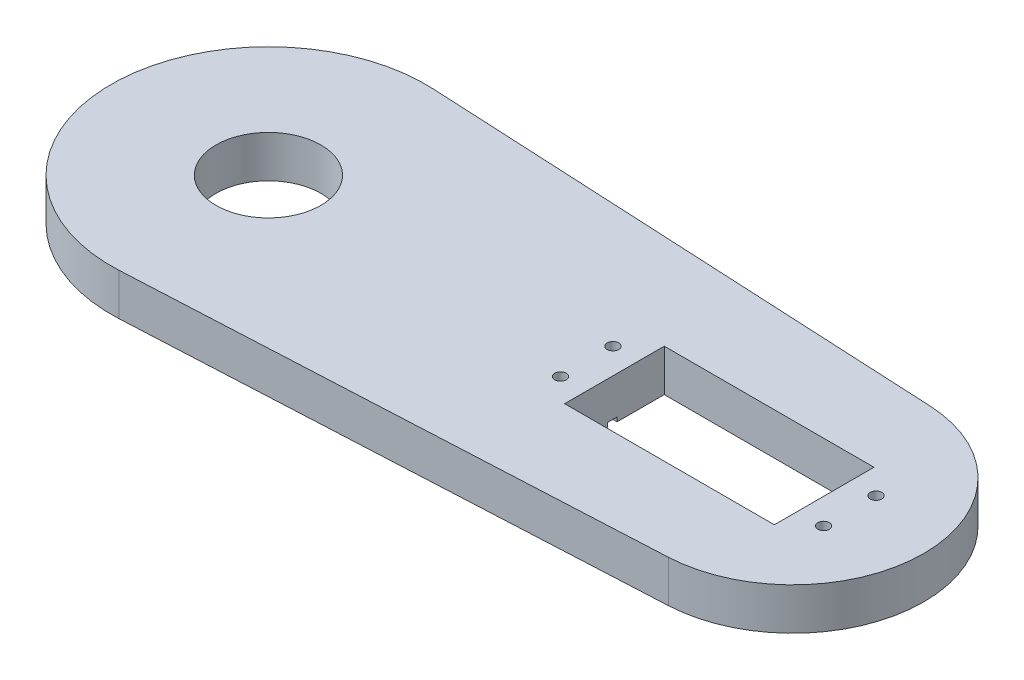
ISO-10303-21;
HEADER;
FILE_DESCRIPTION(('STEP AP214'),'2;1');
FILE_NAME('part.step','',(''),(''),'','','');
FILE_SCHEMA(('AUTOMOTIVE_DESIGN { 1 0 10303 214 1 1 1 1 }'));
ENDSEC;
DATA;
#1=APPLICATION_CONTEXT('core data for automotive mechanical design processes');
#2=APPLICATION_PROTOCOL_DEFINITION('international standard','automotive_design',2000,#1);
#3=PRODUCT_CONTEXT('',#1,'mechanical');
#4=PRODUCT('Part','Part','',(#3));
#5=PRODUCT_RELATED_PRODUCT_CATEGORY('part','',(#4));
#6=PRODUCT_DEFINITION_FORMATION('','',#4);
#7=PRODUCT_DEFINITION_CONTEXT('part definition',#1,'design');
#8=PRODUCT_DEFINITION('design','',#6,#7);
#9=PRODUCT_DEFINITION_SHAPE('','',#8);
#10=(LENGTH_UNIT() NAMED_UNIT(*) SI_UNIT(.MILLI.,.METRE.));
#11=(NAMED_UNIT(*) PLANE_ANGLE_UNIT() SI_UNIT($,.RADIAN.));
#12=(NAMED_UNIT(*) SI_UNIT($,.STERADIAN.) SOLID_ANGLE_UNIT());
#13=UNCERTAINTY_MEASURE_WITH_UNIT(LENGTH_MEASURE(1.E-05),#10,'distance_accuracy_value','');
#14=(GEOMETRIC_REPRESENTATION_CONTEXT(3) GLOBAL_UNCERTAINTY_ASSIGNED_CONTEXT((#13)) GLOBAL_UNIT_ASSIGNED_CONTEXT((#10,
#11,#12)) REPRESENTATION_CONTEXT('',''));
#15=CARTESIAN_POINT('',(0.,0.,0.));
#16=DIRECTION('',(0.,0.,1.));
#17=DIRECTION('',(1.,0.,0.));
#18=AXIS2_PLACEMENT_3D('',#15,#16,#17);
#19=CARTESIAN_POINT('',(100.,8.,0.));
#20=DIRECTION('',(0.,1.,0.));
#21=DIRECTION('',(0.,0.,1.));
#22=AXIS2_PLACEMENT_3D('',#19,#20,#21);
#23=PLANE('',#22);
#24=CARTESIAN_POINT('',(0.,8.,0.));
#25=DIRECTION('',(0.,-1.,0.));
#26=DIRECTION('',(0.,0.,-1.));
#27=AXIS2_PLACEMENT_3D('',#24,#25,#26);
#28=CIRCLE('',#27,10.);
#29=CARTESIAN_POINT('',(0.,8.,-10.));
#30=VERTEX_POINT('',#29);
#31=EDGE_CURVE('E204',#30,#30,#28,.T.);
#32=ORIENTED_EDGE('',*,*,#31,.T.);
#33=EDGE_LOOP('',(#32));
#34=FACE_BOUND('',#33,.T.);
#35=CARTESIAN_POINT('',(61.1116070970547,8.,-4.6));
#36=DIRECTION('',(0.,1.,0.));
#37=DIRECTION('',(0.,0.,1.));
#38=AXIS2_PLACEMENT_3D('',#35,#36,#37);
#39=CIRCLE('',#38,1.1);
#40=CARTESIAN_POINT('',(61.1116070970547,8.,-3.5));
#41=VERTEX_POINT('',#40);
#42=EDGE_CURVE('E215',#41,#41,#39,.T.);
#43=ORIENTED_EDGE('',*,*,#42,.F.);
#44=EDGE_LOOP('',(#43));
#45=FACE_BOUND('',#44,.T.);
#46=CARTESIAN_POINT('',(110.89,8.,5.));
#47=DIRECTION('',(0.,1.,0.));
#48=DIRECTION('',(0.,0.,1.));
#49=AXIS2_PLACEMENT_3D('',#46,#47,#48);
#50=CIRCLE('',#49,1.10000000000001);
#51=CARTESIAN_POINT('',(110.89,8.,6.10000000000001));
#52=VERTEX_POINT('',#51);
#53=EDGE_CURVE('E227',#52,#52,#50,.T.);
#54=ORIENTED_EDGE('',*,*,#53,.F.);
#55=EDGE_LOOP('',(#54));
#56=FACE_BOUND('',#55,.T.);
#57=CARTESIAN_POINT('',(100.,8.,0.));
#58=DIRECTION('',(0.,1.,0.));
#59=DIRECTION('',(0.,0.,1.));
#60=AXIS2_PLACEMENT_3D('',#57,#58,#59);
#61=CIRCLE('',#60,25.);
#62=CARTESIAN_POINT('',(101.25,8.,24.9687304442977));
#63=VERTEX_POINT('',#62);
#64=CARTESIAN_POINT('',(101.25,8.,-24.9687304442977));
#65=VERTEX_POINT('',#64);
#66=EDGE_CURVE('E273',#63,#65,#61,.T.);
#67=ORIENTED_EDGE('',*,*,#66,.T.);
#68=DIRECTION('',(-0.998749217771909,0.,-0.05));
#69=VECTOR('',#68,1.);
#70=CARTESIAN_POINT('',(1.5,8.,-29.9624765331573));
#71=LINE('',#70,#69);
#72=CARTESIAN_POINT('',(1.5,8.,-29.9624765331573));
#73=VERTEX_POINT('',#72);
#74=EDGE_CURVE('E276',#65,#73,#71,.T.);
#75=ORIENTED_EDGE('',*,*,#74,.T.);
#76=CARTESIAN_POINT('',(0.,8.,0.));
#77=DIRECTION('',(0.,1.,0.));
#78=DIRECTION('',(0.,0.,1.));
#79=AXIS2_PLACEMENT_3D('',#76,#77,#78);
#80=CIRCLE('',#79,30.);
#81=CARTESIAN_POINT('',(1.5,8.,29.9624765331573));
#82=VERTEX_POINT('',#81);
#83=EDGE_CURVE('E279',#73,#82,#80,.T.);
#84=ORIENTED_EDGE('',*,*,#83,.T.);
#85=DIRECTION('',(0.998749217771909,0.,-0.05));
#86=VECTOR('',#85,1.);
#87=CARTESIAN_POINT('',(1.5,8.,29.9624765331573));
#88=LINE('',#87,#86);
#89=EDGE_CURVE('E281',#82,#63,#88,.T.);
#90=ORIENTED_EDGE('',*,*,#89,.T.);
#91=EDGE_LOOP('',(#67,#75,#84,#90));
#92=FACE_BOUND('',#91,.T.);
#93=CARTESIAN_POINT('',(110.89,8.,-5.));
#94=DIRECTION('',(0.,1.,0.));
#95=DIRECTION('',(0.,0.,1.));
#96=AXIS2_PLACEMENT_3D('',#93,#94,#95);
#97=CIRCLE('',#96,1.10000000000001);
#98=CARTESIAN_POINT('',(110.89,8.,-3.89999999999999));
#99=VERTEX_POINT('',#98);
#100=EDGE_CURVE('E267',#99,#99,#97,.T.);
#101=ORIENTED_EDGE('',*,*,#100,.F.);
#102=EDGE_LOOP('',(#101));
#103=FACE_BOUND('',#102,.T.);
#104=DIRECTION('',(1.,0.,0.));
#105=VECTOR('',#104,1.);
#106=CARTESIAN_POINT('',(66.,8.,9.5));
#107=LINE('',#106,#105);
#108=CARTESIAN_POINT('',(66.,8.,9.5));
#109=VERTEX_POINT('',#108);
#110=CARTESIAN_POINT('',(106.,8.,9.50000000000001));
#111=VERTEX_POINT('',#110);
#112=EDGE_CURVE('E235',#109,#111,#107,.T.);
#113=ORIENTED_EDGE('',*,*,#112,.F.);
#114=DIRECTION('',(0.,0.,1.));
#115=VECTOR('',#114,1.);
#116=CARTESIAN_POINT('',(66.,8.,9.5));
#117=LINE('',#116,#115);
#118=CARTESIAN_POINT('',(66.,8.,-9.5));
#119=VERTEX_POINT('',#118);
#120=EDGE_CURVE('E233',#119,#109,#117,.T.);
#121=ORIENTED_EDGE('',*,*,#120,.F.);
#122=DIRECTION('',(-1.,0.,0.));
#123=VECTOR('',#122,1.);
#124=CARTESIAN_POINT('',(66.,8.,-9.5));
#125=LINE('',#124,#123);
#126=CARTESIAN_POINT('',(106.,8.,-9.5));
#127=VERTEX_POINT('',#126);
#128=EDGE_CURVE('E241',#127,#119,#125,.T.);
#129=ORIENTED_EDGE('',*,*,#128,.F.);
#130=DIRECTION('',(0.,0.,-1.));
#131=VECTOR('',#130,1.);
#132=CARTESIAN_POINT('',(106.,8.,9.50000000000001));
#133=LINE('',#132,#131);
#134=EDGE_CURVE('E238',#111,#127,#133,.T.);
#135=ORIENTED_EDGE('',*,*,#134,.F.);
#136=EDGE_LOOP('',(#113,#121,#129,#135));
#137=FACE_BOUND('',#136,.T.);
#138=CARTESIAN_POINT('',(61.1116070970547,8.,5.4));
#139=DIRECTION('',(0.,1.,0.));
#140=DIRECTION('',(0.,0.,1.));
#141=AXIS2_PLACEMENT_3D('',#138,#139,#140);
#142=CIRCLE('',#141,1.1);
#143=CARTESIAN_POINT('',(61.1116070970547,8.,6.5));
#144=VERTEX_POINT('',#143);
#145=EDGE_CURVE('E221',#144,#144,#142,.T.);
#146=ORIENTED_EDGE('',*,*,#145,.F.);
#147=EDGE_LOOP('',(#146));
#148=FACE_BOUND('',#147,.T.);
#149=ADVANCED_FACE('F36',(#34,#45,#56,#92,#103,#137,#148),#23,.T.);
#150=CARTESIAN_POINT('',(100.,0.,0.));
#151=DIRECTION('',(0.,1.,0.));
#152=DIRECTION('',(0.,0.,1.));
#153=AXIS2_PLACEMENT_3D('',#150,#151,#152);
#154=PLANE('',#153);
#155=CARTESIAN_POINT('',(0.,0.,0.));
#156=DIRECTION('',(0.,-1.,0.));
#157=DIRECTION('',(0.,0.,-1.));
#158=AXIS2_PLACEMENT_3D('',#155,#156,#157);
#159=CIRCLE('',#158,10.);
#160=CARTESIAN_POINT('',(0.,0.,-10.));
#161=VERTEX_POINT('',#160);
#162=EDGE_CURVE('E176',#161,#161,#159,.T.);
#163=ORIENTED_EDGE('',*,*,#162,.F.);
#164=EDGE_LOOP('',(#163));
#165=FACE_BOUND('',#164,.T.);
#166=CARTESIAN_POINT('',(110.89,0.,-5.));
#167=DIRECTION('',(0.,1.,0.));
#168=DIRECTION('',(0.,0.,1.));
#169=AXIS2_PLACEMENT_3D('',#166,#167,#168);
#170=CIRCLE('',#169,1.10000000000001);
#171=CARTESIAN_POINT('',(110.89,0.,-3.89999999999999));
#172=VERTEX_POINT('',#171);
#173=EDGE_CURVE('E266',#172,#172,#170,.T.);
#174=ORIENTED_EDGE('',*,*,#173,.T.);
#175=EDGE_LOOP('',(#174));
#176=FACE_BOUND('',#175,.T.);
#177=CARTESIAN_POINT('',(100.,0.,0.));
#178=DIRECTION('',(0.,1.,0.));
#179=DIRECTION('',(0.,0.,1.));
#180=AXIS2_PLACEMENT_3D('',#177,#178,#179);
#181=CIRCLE('',#180,25.);
#182=CARTESIAN_POINT('',(101.25,0.,24.9687304442977));
#183=VERTEX_POINT('',#182);
#184=CARTESIAN_POINT('',(101.25,0.,-24.9687304442977));
#185=VERTEX_POINT('',#184);
#186=EDGE_CURVE('E270',#183,#185,#181,.T.);
#187=ORIENTED_EDGE('',*,*,#186,.F.);
#188=DIRECTION('',(0.998749217771909,0.,-0.05));
#189=VECTOR('',#188,1.);
#190=CARTESIAN_POINT('',(1.5,0.,29.9624765331573));
#191=LINE('',#190,#189);
#192=CARTESIAN_POINT('',(1.5,0.,29.9624765331573));
#193=VERTEX_POINT('',#192);
#194=EDGE_CURVE('E277',#193,#183,#191,.T.);
#195=ORIENTED_EDGE('',*,*,#194,.F.);
#196=CARTESIAN_POINT('',(0.,0.,0.));
#197=DIRECTION('',(0.,1.,0.));
#198=DIRECTION('',(0.,0.,1.));
#199=AXIS2_PLACEMENT_3D('',#196,#197,#198);
#200=CIRCLE('',#199,30.);
#201=CARTESIAN_POINT('',(1.5,0.,-29.9624765331573));
#202=VERTEX_POINT('',#201);
#203=EDGE_CURVE('E288',#202,#193,#200,.T.);
#204=ORIENTED_EDGE('',*,*,#203,.F.);
#205=DIRECTION('',(-0.998749217771909,0.,-0.05));
#206=VECTOR('',#205,1.);
#207=CARTESIAN_POINT('',(1.5,0.,-29.9624765331573));
#208=LINE('',#207,#206);
#209=EDGE_CURVE('E286',#185,#202,#208,.T.);
#210=ORIENTED_EDGE('',*,*,#209,.F.);
#211=EDGE_LOOP('',(#187,#195,#204,#210));
#212=FACE_BOUND('',#211,.T.);
#213=DIRECTION('',(0.,0.,-1.));
#214=VECTOR('',#213,1.);
#215=CARTESIAN_POINT('',(59.,0.,-0.499999999999999));
#216=LINE('',#215,#214);
#217=CARTESIAN_POINT('',(59.,0.,1.3));
#218=VERTEX_POINT('',#217);
#219=CARTESIAN_POINT('',(59.,0.,-0.499999999999999));
#220=VERTEX_POINT('',#219);
#221=EDGE_CURVE('E157',#218,#220,#216,.T.);
#222=ORIENTED_EDGE('',*,*,#221,.F.);
#223=DIRECTION('',(-1.,0.,0.));
#224=VECTOR('',#223,1.);
#225=CARTESIAN_POINT('',(59.,0.,1.3));
#226=LINE('',#225,#224);
#227=CARTESIAN_POINT('',(66.,0.,1.3));
#228=VERTEX_POINT('',#227);
#229=EDGE_CURVE('E170',#228,#218,#226,.T.);
#230=ORIENTED_EDGE('',*,*,#229,.F.);
#231=DIRECTION('',(0.,0.,1.));
#232=VECTOR('',#231,1.);
#233=CARTESIAN_POINT('',(66.,0.,9.5));
#234=LINE('',#233,#232);
#235=CARTESIAN_POINT('',(66.,0.,9.5));
#236=VERTEX_POINT('',#235);
#237=EDGE_CURVE('E230',#228,#236,#234,.T.);
#238=ORIENTED_EDGE('',*,*,#237,.T.);
#239=DIRECTION('',(1.,0.,0.));
#240=VECTOR('',#239,1.);
#241=CARTESIAN_POINT('',(66.,0.,9.5));
#242=LINE('',#241,#240);
#243=CARTESIAN_POINT('',(106.,0.,9.50000000000001));
#244=VERTEX_POINT('',#243);
#245=EDGE_CURVE('E247',#236,#244,#242,.T.);
#246=ORIENTED_EDGE('',*,*,#245,.T.);
#247=DIRECTION('',(0.,0.,-1.));
#248=VECTOR('',#247,1.);
#249=CARTESIAN_POINT('',(106.,0.,9.50000000000001));
#250=LINE('',#249,#248);
#251=CARTESIAN_POINT('',(106.,0.,1.3));
#252=VERTEX_POINT('',#251);
#253=EDGE_CURVE('E251',#244,#252,#250,.T.);
#254=ORIENTED_EDGE('',*,*,#253,.T.);
#255=DIRECTION('',(-1.,0.,0.));
#256=VECTOR('',#255,1.);
#257=CARTESIAN_POINT('',(113.,0.,1.3));
#258=LINE('',#257,#256);
#259=CARTESIAN_POINT('',(113.,0.,1.3));
#260=VERTEX_POINT('',#259);
#261=EDGE_CURVE('E194',#260,#252,#258,.T.);
#262=ORIENTED_EDGE('',*,*,#261,.F.);
#263=DIRECTION('',(0.,0.,1.));
#264=VECTOR('',#263,1.);
#265=CARTESIAN_POINT('',(113.,0.,-0.499999999999999));
#266=LINE('',#265,#264);
#267=CARTESIAN_POINT('',(113.,0.,-0.499999999999999));
#268=VERTEX_POINT('',#267);
#269=EDGE_CURVE('E203',#268,#260,#266,.T.);
#270=ORIENTED_EDGE('',*,*,#269,.F.);
#271=DIRECTION('',(1.,0.,0.));
#272=VECTOR('',#271,1.);
#273=CARTESIAN_POINT('',(106.,0.,-0.499999999999998));
#274=LINE('',#273,#272);
#275=CARTESIAN_POINT('',(106.,0.,-0.499999999999998));
#276=VERTEX_POINT('',#275);
#277=EDGE_CURVE('E200',#276,#268,#274,.T.);
#278=ORIENTED_EDGE('',*,*,#277,.F.);
#279=CARTESIAN_POINT('',(106.,0.,-9.5));
#280=VERTEX_POINT('',#279);
#281=EDGE_CURVE('E250',#276,#280,#250,.T.);
#282=ORIENTED_EDGE('',*,*,#281,.T.);
#283=DIRECTION('',(-1.,0.,0.));
#284=VECTOR('',#283,1.);
#285=CARTESIAN_POINT('',(66.,0.,-9.5));
#286=LINE('',#285,#284);
#287=CARTESIAN_POINT('',(66.,0.,-9.5));
#288=VERTEX_POINT('',#287);
#289=EDGE_CURVE('E236',#280,#288,#286,.T.);
#290=ORIENTED_EDGE('',*,*,#289,.T.);
#291=CARTESIAN_POINT('',(66.,0.,-0.499999999999998));
#292=VERTEX_POINT('',#291);
#293=EDGE_CURVE('E244',#288,#292,#234,.T.);
#294=ORIENTED_EDGE('',*,*,#293,.T.);
#295=DIRECTION('',(1.,0.,0.));
#296=VECTOR('',#295,1.);
#297=CARTESIAN_POINT('',(66.,0.,-0.499999999999998));
#298=LINE('',#297,#296);
#299=EDGE_CURVE('E173',#220,#292,#298,.T.);
#300=ORIENTED_EDGE('',*,*,#299,.F.);
#301=EDGE_LOOP('',(#222,#230,#238,#246,#254,#262,#270,#278,#282,#290,#294,#300));
#302=FACE_BOUND('',#301,.T.);
#303=CARTESIAN_POINT('',(110.89,0.,5.));
#304=DIRECTION('',(0.,1.,0.));
#305=DIRECTION('',(0.,0.,1.));
#306=AXIS2_PLACEMENT_3D('',#303,#304,#305);
#307=CIRCLE('',#306,1.10000000000001);
#308=CARTESIAN_POINT('',(110.89,0.,6.10000000000001));
#309=VERTEX_POINT('',#308);
#310=EDGE_CURVE('E224',#309,#309,#307,.T.);
#311=ORIENTED_EDGE('',*,*,#310,.T.);
#312=EDGE_LOOP('',(#311));
#313=FACE_BOUND('',#312,.T.);
#314=CARTESIAN_POINT('',(61.1116070970547,0.,5.4));
#315=DIRECTION('',(0.,1.,0.));
#316=DIRECTION('',(0.,0.,1.));
#317=AXIS2_PLACEMENT_3D('',#314,#315,#316);
#318=CIRCLE('',#317,1.1);
#319=CARTESIAN_POINT('',(61.1116070970547,0.,6.5));
#320=VERTEX_POINT('',#319);
#321=EDGE_CURVE('E218',#320,#320,#318,.T.);
#322=ORIENTED_EDGE('',*,*,#321,.T.);
#323=EDGE_LOOP('',(#322));
#324=FACE_BOUND('',#323,.T.);
#325=CARTESIAN_POINT('',(61.1116070970547,0.,-4.6));
#326=DIRECTION('',(0.,1.,0.));
#327=DIRECTION('',(0.,0.,1.));
#328=AXIS2_PLACEMENT_3D('',#325,#326,#327);
#329=CIRCLE('',#328,1.1);
#330=CARTESIAN_POINT('',(61.1116070970547,0.,-3.5));
#331=VERTEX_POINT('',#330);
#332=EDGE_CURVE('E186',#331,#331,#329,.T.);
#333=ORIENTED_EDGE('',*,*,#332,.T.);
#334=EDGE_LOOP('',(#333));
#335=FACE_BOUND('',#334,.T.);
#336=ADVANCED_FACE('F306',(#165,#176,#212,#302,#313,#324,#335),#154,.F.);
#337=CARTESIAN_POINT('',(100.,8.,0.));
#338=DIRECTION('',(0.,-1.,0.));
#339=DIRECTION('',(0.,0.,-1.));
#340=AXIS2_PLACEMENT_3D('',#337,#338,#339);
#341=CYLINDRICAL_SURFACE('',#340,25.);
#342=ORIENTED_EDGE('',*,*,#186,.T.);
#343=DIRECTION('',(0.,-1.,0.));
#344=VECTOR('',#343,1.);
#345=CARTESIAN_POINT('',(101.25,8.,-24.9687304442977));
#346=LINE('',#345,#344);
#347=EDGE_CURVE('E11',#65,#185,#346,.T.);
#348=ORIENTED_EDGE('',*,*,#347,.F.);
#349=ORIENTED_EDGE('',*,*,#66,.F.);
#350=DIRECTION('',(0.,-1.,0.));
#351=VECTOR('',#350,1.);
#352=CARTESIAN_POINT('',(101.25,8.,24.9687304442977));
#353=LINE('',#352,#351);
#354=EDGE_CURVE('E283',#63,#183,#353,.T.);
#355=ORIENTED_EDGE('',*,*,#354,.T.);
#356=EDGE_LOOP('',(#342,#348,#349,#355));
#357=FACE_BOUND('',#356,.T.);
#358=ADVANCED_FACE('F38',(#357),#341,.T.);
#359=CARTESIAN_POINT('',(1.5,8.,-29.9624765331573));
#360=DIRECTION('',(-0.05,0.,0.998749217771909));
#361=DIRECTION('',(0.998749217771909,0.,0.05));
#362=AXIS2_PLACEMENT_3D('',#359,#360,#361);
#363=PLANE('',#362);
#364=ORIENTED_EDGE('',*,*,#209,.T.);
#365=DIRECTION('',(0.,-1.,0.));
#366=VECTOR('',#365,1.);
#367=CARTESIAN_POINT('',(1.5,8.,-29.9624765331573));
#368=LINE('',#367,#366);
#369=EDGE_CURVE('E44',#73,#202,#368,.T.);
#370=ORIENTED_EDGE('',*,*,#369,.F.);
#371=ORIENTED_EDGE('',*,*,#74,.F.);
#372=ORIENTED_EDGE('',*,*,#347,.T.);
#373=EDGE_LOOP('',(#364,#370,#371,#372));
#374=FACE_BOUND('',#373,.T.);
#375=ADVANCED_FACE('F317',(#374),#363,.F.);
#376=CARTESIAN_POINT('',(0.,8.,0.));
#377=DIRECTION('',(0.,-1.,0.));
#378=DIRECTION('',(0.,0.,-1.));
#379=AXIS2_PLACEMENT_3D('',#376,#377,#378);
#380=CYLINDRICAL_SURFACE('',#379,30.);
#381=ORIENTED_EDGE('',*,*,#203,.T.);
#382=DIRECTION('',(0.,-1.,0.));
#383=VECTOR('',#382,1.);
#384=CARTESIAN_POINT('',(1.5,8.,29.9624765331573));
#385=LINE('',#384,#383);
#386=EDGE_CURVE('E293',#82,#193,#385,.T.);
#387=ORIENTED_EDGE('',*,*,#386,.F.);
#388=ORIENTED_EDGE('',*,*,#83,.F.);
#389=ORIENTED_EDGE('',*,*,#369,.T.);
#390=EDGE_LOOP('',(#381,#387,#388,#389));
#391=FACE_BOUND('',#390,.T.);
#392=ADVANCED_FACE('F300',(#391),#380,.T.);
#393=CARTESIAN_POINT('',(1.5,8.,29.9624765331573));
#394=DIRECTION('',(-0.05,0.,-0.998749217771909));
#395=DIRECTION('',(-0.998749217771909,0.,0.05));
#396=AXIS2_PLACEMENT_3D('',#393,#394,#395);
#397=PLANE('',#396);
#398=ORIENTED_EDGE('',*,*,#194,.T.);
#399=ORIENTED_EDGE('',*,*,#354,.F.);
#400=ORIENTED_EDGE('',*,*,#89,.F.);
#401=ORIENTED_EDGE('',*,*,#386,.T.);
#402=EDGE_LOOP('',(#398,#399,#400,#401));
#403=FACE_BOUND('',#402,.T.);
#404=ADVANCED_FACE('F310',(#403),#397,.F.);
#405=CARTESIAN_POINT('',(110.89,8.,-5.));
#406=DIRECTION('',(0.,-1.,0.));
#407=DIRECTION('',(0.,0.,-1.));
#408=AXIS2_PLACEMENT_3D('',#405,#406,#407);
#409=CYLINDRICAL_SURFACE('',#408,1.10000000000001);
#410=ORIENTED_EDGE('',*,*,#100,.T.);
#411=EDGE_LOOP('',(#410));
#412=FACE_BOUND('',#411,.T.);
#413=ORIENTED_EDGE('',*,*,#173,.F.);
#414=EDGE_LOOP('',(#413));
#415=FACE_BOUND('',#414,.T.);
#416=ADVANCED_FACE('F335',(#412,#415),#409,.F.);
#417=CARTESIAN_POINT('',(66.,8.,9.5));
#418=DIRECTION('',(1.,0.,0.));
#419=DIRECTION('',(0.,0.,-1.));
#420=AXIS2_PLACEMENT_3D('',#417,#418,#419);
#421=PLANE('',#420);
#422=DIRECTION('',(0.,-1.,0.));
#423=VECTOR('',#422,1.);
#424=CARTESIAN_POINT('',(66.,0.8,1.3));
#425=LINE('',#424,#423);
#426=CARTESIAN_POINT('',(66.,0.8,1.3));
#427=VERTEX_POINT('',#426);
#428=EDGE_CURVE('E187',#427,#228,#425,.T.);
#429=ORIENTED_EDGE('',*,*,#428,.F.);
#430=DIRECTION('',(0.,0.,1.));
#431=VECTOR('',#430,1.);
#432=CARTESIAN_POINT('',(66.,0.8,1.3));
#433=LINE('',#432,#431);
#434=CARTESIAN_POINT('',(66.,0.8,-0.499999999999999));
#435=VERTEX_POINT('',#434);
#436=EDGE_CURVE('E166',#435,#427,#433,.T.);
#437=ORIENTED_EDGE('',*,*,#436,.F.);
#438=DIRECTION('',(0.,-1.,0.));
#439=VECTOR('',#438,1.);
#440=CARTESIAN_POINT('',(66.,0.8,-0.499999999999998));
#441=LINE('',#440,#439);
#442=EDGE_CURVE('E160',#435,#292,#441,.T.);
#443=ORIENTED_EDGE('',*,*,#442,.T.);
#444=ORIENTED_EDGE('',*,*,#293,.F.);
#445=DIRECTION('',(0.,-1.,0.));
#446=VECTOR('',#445,1.);
#447=CARTESIAN_POINT('',(66.,8.,-9.5));
#448=LINE('',#447,#446);
#449=EDGE_CURVE('E243',#119,#288,#448,.T.);
#450=ORIENTED_EDGE('',*,*,#449,.F.);
#451=ORIENTED_EDGE('',*,*,#120,.T.);
#452=DIRECTION('',(0.,-1.,0.));
#453=VECTOR('',#452,1.);
#454=CARTESIAN_POINT('',(66.,8.,9.5));
#455=LINE('',#454,#453);
#456=EDGE_CURVE('E263',#109,#236,#455,.T.);
#457=ORIENTED_EDGE('',*,*,#456,.T.);
#458=ORIENTED_EDGE('',*,*,#237,.F.);
#459=EDGE_LOOP('',(#429,#437,#443,#444,#450,#451,#457,#458));
#460=FACE_BOUND('',#459,.T.);
#461=ADVANCED_FACE('F342',(#460),#421,.T.);
#462=CARTESIAN_POINT('',(66.,8.,9.5));
#463=DIRECTION('',(0.,0.,-1.));
#464=DIRECTION('',(-1.,0.,0.));
#465=AXIS2_PLACEMENT_3D('',#462,#463,#464);
#466=PLANE('',#465);
#467=ORIENTED_EDGE('',*,*,#245,.F.);
#468=ORIENTED_EDGE('',*,*,#456,.F.);
#469=ORIENTED_EDGE('',*,*,#112,.T.);
#470=DIRECTION('',(0.,-1.,0.));
#471=VECTOR('',#470,1.);
#472=CARTESIAN_POINT('',(106.,8.,9.50000000000001));
#473=LINE('',#472,#471);
#474=EDGE_CURVE('E261',#111,#244,#473,.T.);
#475=ORIENTED_EDGE('',*,*,#474,.T.);
#476=EDGE_LOOP('',(#467,#468,#469,#475));
#477=FACE_BOUND('',#476,.T.);
#478=ADVANCED_FACE('F347',(#477),#466,.T.);
#479=CARTESIAN_POINT('',(106.,8.,9.50000000000001));
#480=DIRECTION('',(-1.,0.,0.));
#481=DIRECTION('',(0.,0.,1.));
#482=AXIS2_PLACEMENT_3D('',#479,#480,#481);
#483=PLANE('',#482);
#484=DIRECTION('',(0.,-1.,0.));
#485=VECTOR('',#484,1.);
#486=CARTESIAN_POINT('',(106.,0.8,-0.499999999999998));
#487=LINE('',#486,#485);
#488=CARTESIAN_POINT('',(106.,0.8,-0.499999999999998));
#489=VERTEX_POINT('',#488);
#490=EDGE_CURVE('E182',#489,#276,#487,.T.);
#491=ORIENTED_EDGE('',*,*,#490,.F.);
#492=DIRECTION('',(0.,0.,-1.));
#493=VECTOR('',#492,1.);
#494=CARTESIAN_POINT('',(106.,0.8,1.3));
#495=LINE('',#494,#493);
#496=CARTESIAN_POINT('',(106.,0.8,1.3));
#497=VERTEX_POINT('',#496);
#498=EDGE_CURVE('E197',#497,#489,#495,.T.);
#499=ORIENTED_EDGE('',*,*,#498,.F.);
#500=DIRECTION('',(0.,-1.,0.));
#501=VECTOR('',#500,1.);
#502=CARTESIAN_POINT('',(106.,0.8,1.3));
#503=LINE('',#502,#501);
#504=EDGE_CURVE('E209',#497,#252,#503,.T.);
#505=ORIENTED_EDGE('',*,*,#504,.T.);
#506=ORIENTED_EDGE('',*,*,#253,.F.);
#507=ORIENTED_EDGE('',*,*,#474,.F.);
#508=ORIENTED_EDGE('',*,*,#134,.T.);
#509=DIRECTION('',(0.,-1.,0.));
#510=VECTOR('',#509,1.);
#511=CARTESIAN_POINT('',(106.,8.,-9.5));
#512=LINE('',#511,#510);
#513=EDGE_CURVE('E258',#127,#280,#512,.T.);
#514=ORIENTED_EDGE('',*,*,#513,.T.);
#515=ORIENTED_EDGE('',*,*,#281,.F.);
#516=EDGE_LOOP('',(#491,#499,#505,#506,#507,#508,#514,#515));
#517=FACE_BOUND('',#516,.T.);
#518=ADVANCED_FACE('F389',(#517),#483,.T.);
#519=CARTESIAN_POINT('',(66.,8.,-9.5));
#520=DIRECTION('',(0.,0.,1.));
#521=DIRECTION('',(1.,0.,0.));
#522=AXIS2_PLACEMENT_3D('',#519,#520,#521);
#523=PLANE('',#522);
#524=ORIENTED_EDGE('',*,*,#289,.F.);
#525=ORIENTED_EDGE('',*,*,#513,.F.);
#526=ORIENTED_EDGE('',*,*,#128,.T.);
#527=ORIENTED_EDGE('',*,*,#449,.T.);
#528=EDGE_LOOP('',(#524,#525,#526,#527));
#529=FACE_BOUND('',#528,.T.);
#530=ADVANCED_FACE('F385',(#529),#523,.T.);
#531=CARTESIAN_POINT('',(110.89,8.,5.));
#532=DIRECTION('',(0.,-1.,0.));
#533=DIRECTION('',(0.,0.,-1.));
#534=AXIS2_PLACEMENT_3D('',#531,#532,#533);
#535=CYLINDRICAL_SURFACE('',#534,1.10000000000001);
#536=ORIENTED_EDGE('',*,*,#53,.T.);
#537=EDGE_LOOP('',(#536));
#538=FACE_BOUND('',#537,.T.);
#539=ORIENTED_EDGE('',*,*,#310,.F.);
#540=EDGE_LOOP('',(#539));
#541=FACE_BOUND('',#540,.T.);
#542=ADVANCED_FACE('F364',(#538,#541),#535,.F.);
#543=CARTESIAN_POINT('',(61.1116070970547,8.,5.4));
#544=DIRECTION('',(0.,-1.,0.));
#545=DIRECTION('',(0.,0.,-1.));
#546=AXIS2_PLACEMENT_3D('',#543,#544,#545);
#547=CYLINDRICAL_SURFACE('',#546,1.1);
#548=ORIENTED_EDGE('',*,*,#145,.T.);
#549=EDGE_LOOP('',(#548));
#550=FACE_BOUND('',#549,.T.);
#551=ORIENTED_EDGE('',*,*,#321,.F.);
#552=EDGE_LOOP('',(#551));
#553=FACE_BOUND('',#552,.T.);
#554=ADVANCED_FACE('F360',(#550,#553),#547,.F.);
#555=CARTESIAN_POINT('',(61.1116070970547,8.,-4.6));
#556=DIRECTION('',(0.,-1.,0.));
#557=DIRECTION('',(0.,0.,-1.));
#558=AXIS2_PLACEMENT_3D('',#555,#556,#557);
#559=CYLINDRICAL_SURFACE('',#558,1.1);
#560=ORIENTED_EDGE('',*,*,#42,.T.);
#561=EDGE_LOOP('',(#560));
#562=FACE_BOUND('',#561,.T.);
#563=ORIENTED_EDGE('',*,*,#332,.F.);
#564=EDGE_LOOP('',(#563));
#565=FACE_BOUND('',#564,.T.);
#566=ADVANCED_FACE('F363',(#562,#565),#559,.F.);
#567=CARTESIAN_POINT('',(106.,0.8,-0.499999999999998));
#568=DIRECTION('',(0.,0.,-1.));
#569=DIRECTION('',(-1.,0.,0.));
#570=AXIS2_PLACEMENT_3D('',#567,#568,#569);
#571=PLANE('',#570);
#572=ORIENTED_EDGE('',*,*,#277,.T.);
#573=DIRECTION('',(0.,-1.,0.));
#574=VECTOR('',#573,1.);
#575=CARTESIAN_POINT('',(113.,0.8,-0.499999999999999));
#576=LINE('',#575,#574);
#577=CARTESIAN_POINT('',(113.,0.8,-0.499999999999999));
#578=VERTEX_POINT('',#577);
#579=EDGE_CURVE('E199',#578,#268,#576,.T.);
#580=ORIENTED_EDGE('',*,*,#579,.F.);
#581=DIRECTION('',(1.,0.,0.));
#582=VECTOR('',#581,1.);
#583=CARTESIAN_POINT('',(106.,0.8,-0.499999999999998));
#584=LINE('',#583,#582);
#585=EDGE_CURVE('E190',#489,#578,#584,.T.);
#586=ORIENTED_EDGE('',*,*,#585,.F.);
#587=ORIENTED_EDGE('',*,*,#490,.T.);
#588=EDGE_LOOP('',(#572,#580,#586,#587));
#589=FACE_BOUND('',#588,.T.);
#590=ADVANCED_FACE('F372',(#589),#571,.F.);
#591=CARTESIAN_POINT('',(113.,0.8,1.3));
#592=DIRECTION('',(0.,0.,1.));
#593=DIRECTION('',(1.,0.,0.));
#594=AXIS2_PLACEMENT_3D('',#591,#592,#593);
#595=PLANE('',#594);
#596=ORIENTED_EDGE('',*,*,#261,.T.);
#597=ORIENTED_EDGE('',*,*,#504,.F.);
#598=DIRECTION('',(-1.,0.,0.));
#599=VECTOR('',#598,1.);
#600=CARTESIAN_POINT('',(113.,0.8,1.3));
#601=LINE('',#600,#599);
#602=CARTESIAN_POINT('',(113.,0.8,1.3));
#603=VERTEX_POINT('',#602);
#604=EDGE_CURVE('E59',#603,#497,#601,.T.);
#605=ORIENTED_EDGE('',*,*,#604,.F.);
#606=DIRECTION('',(0.,-1.,0.));
#607=VECTOR('',#606,1.);
#608=CARTESIAN_POINT('',(113.,0.8,1.3));
#609=LINE('',#608,#607);
#610=EDGE_CURVE('E212',#603,#260,#609,.T.);
#611=ORIENTED_EDGE('',*,*,#610,.T.);
#612=EDGE_LOOP('',(#596,#597,#605,#611));
#613=FACE_BOUND('',#612,.T.);
#614=ADVANCED_FACE('F378',(#613),#595,.F.);
#615=CARTESIAN_POINT('',(113.,0.8,-0.499999999999999));
#616=DIRECTION('',(1.,0.,0.));
#617=DIRECTION('',(0.,0.,-1.));
#618=AXIS2_PLACEMENT_3D('',#615,#616,#617);
#619=PLANE('',#618);
#620=ORIENTED_EDGE('',*,*,#269,.T.);
#621=ORIENTED_EDGE('',*,*,#610,.F.);
#622=DIRECTION('',(0.,0.,1.));
#623=VECTOR('',#622,1.);
#624=CARTESIAN_POINT('',(113.,0.8,-0.499999999999999));
#625=LINE('',#624,#623);
#626=EDGE_CURVE('E193',#578,#603,#625,.T.);
#627=ORIENTED_EDGE('',*,*,#626,.F.);
#628=ORIENTED_EDGE('',*,*,#579,.T.);
#629=EDGE_LOOP('',(#620,#621,#627,#628));
#630=FACE_BOUND('',#629,.T.);
#631=ADVANCED_FACE('F417',(#630),#619,.F.);
#632=CARTESIAN_POINT('',(0.,0.8,0.));
#633=DIRECTION('',(0.,-1.,0.));
#634=DIRECTION('',(0.,0.,-1.));
#635=AXIS2_PLACEMENT_3D('',#632,#633,#634);
#636=PLANE('',#635);
#637=ORIENTED_EDGE('',*,*,#585,.T.);
#638=ORIENTED_EDGE('',*,*,#626,.T.);
#639=ORIENTED_EDGE('',*,*,#604,.T.);
#640=ORIENTED_EDGE('',*,*,#498,.T.);
#641=EDGE_LOOP('',(#637,#638,#639,#640));
#642=FACE_BOUND('',#641,.T.);
#643=ADVANCED_FACE('F418',(#642),#636,.T.);
#644=CARTESIAN_POINT('',(59.,0.8,-0.499999999999999));
#645=DIRECTION('',(-1.,0.,0.));
#646=DIRECTION('',(0.,0.,1.));
#647=AXIS2_PLACEMENT_3D('',#644,#645,#646);
#648=PLANE('',#647);
#649=ORIENTED_EDGE('',*,*,#221,.T.);
#650=DIRECTION('',(0.,-1.,0.));
#651=VECTOR('',#650,1.);
#652=CARTESIAN_POINT('',(59.,0.8,-0.499999999999999));
#653=LINE('',#652,#651);
#654=CARTESIAN_POINT('',(59.,0.8,-0.499999999999999));
#655=VERTEX_POINT('',#654);
#656=EDGE_CURVE('E152',#655,#220,#653,.T.);
#657=ORIENTED_EDGE('',*,*,#656,.F.);
#658=DIRECTION('',(0.,0.,-1.));
#659=VECTOR('',#658,1.);
#660=CARTESIAN_POINT('',(59.,0.8,-0.499999999999999));
#661=LINE('',#660,#659);
#662=CARTESIAN_POINT('',(59.,0.8,1.3));
#663=VERTEX_POINT('',#662);
#664=EDGE_CURVE('E154',#663,#655,#661,.T.);
#665=ORIENTED_EDGE('',*,*,#664,.F.);
#666=DIRECTION('',(0.,-1.,0.));
#667=VECTOR('',#666,1.);
#668=CARTESIAN_POINT('',(59.,0.8,1.3));
#669=LINE('',#668,#667);
#670=EDGE_CURVE('E184',#663,#218,#669,.T.);
#671=ORIENTED_EDGE('',*,*,#670,.T.);
#672=EDGE_LOOP('',(#649,#657,#665,#671));
#673=FACE_BOUND('',#672,.T.);
#674=ADVANCED_FACE('F153',(#673),#648,.F.);
#675=CARTESIAN_POINT('',(59.,0.8,1.3));
#676=DIRECTION('',(0.,0.,1.));
#677=DIRECTION('',(1.,0.,0.));
#678=AXIS2_PLACEMENT_3D('',#675,#676,#677);
#679=PLANE('',#678);
#680=ORIENTED_EDGE('',*,*,#229,.T.);
#681=ORIENTED_EDGE('',*,*,#670,.F.);
#682=DIRECTION('',(-1.,0.,0.));
#683=VECTOR('',#682,1.);
#684=CARTESIAN_POINT('',(59.,0.8,1.3));
#685=LINE('',#684,#683);
#686=EDGE_CURVE('E161',#427,#663,#685,.T.);
#687=ORIENTED_EDGE('',*,*,#686,.F.);
#688=ORIENTED_EDGE('',*,*,#428,.T.);
#689=EDGE_LOOP('',(#680,#681,#687,#688));
#690=FACE_BOUND('',#689,.T.);
#691=ADVANCED_FACE('F425',(#690),#679,.F.);
#692=CARTESIAN_POINT('',(66.,0.8,-0.499999999999998));
#693=DIRECTION('',(0.,0.,-1.));
#694=DIRECTION('',(-1.,0.,0.));
#695=AXIS2_PLACEMENT_3D('',#692,#693,#694);
#696=PLANE('',#695);
#697=ORIENTED_EDGE('',*,*,#299,.T.);
#698=ORIENTED_EDGE('',*,*,#442,.F.);
#699=DIRECTION('',(1.,0.,0.));
#700=VECTOR('',#699,1.);
#701=CARTESIAN_POINT('',(66.,0.8,-0.499999999999998));
#702=LINE('',#701,#700);
#703=EDGE_CURVE('E51',#655,#435,#702,.T.);
#704=ORIENTED_EDGE('',*,*,#703,.F.);
#705=ORIENTED_EDGE('',*,*,#656,.T.);
#706=EDGE_LOOP('',(#697,#698,#704,#705));
#707=FACE_BOUND('',#706,.T.);
#708=ADVANCED_FACE('F163',(#707),#696,.F.);
#709=CARTESIAN_POINT('',(0.,0.8,0.));
#710=DIRECTION('',(0.,1.,0.));
#711=DIRECTION('',(0.,0.,1.));
#712=AXIS2_PLACEMENT_3D('',#709,#710,#711);
#713=PLANE('',#712);
#714=ORIENTED_EDGE('',*,*,#664,.T.);
#715=ORIENTED_EDGE('',*,*,#703,.T.);
#716=ORIENTED_EDGE('',*,*,#436,.T.);
#717=ORIENTED_EDGE('',*,*,#686,.T.);
#718=EDGE_LOOP('',(#714,#715,#716,#717));
#719=FACE_BOUND('',#718,.T.);
#720=ADVANCED_FACE('F168',(#719),#713,.F.);
#721=CARTESIAN_POINT('',(0.,8.,0.));
#722=DIRECTION('',(0.,-1.,0.));
#723=DIRECTION('',(0.,0.,-1.));
#724=AXIS2_PLACEMENT_3D('',#721,#722,#723);
#725=CYLINDRICAL_SURFACE('',#724,10.);
#726=ORIENTED_EDGE('',*,*,#31,.F.);
#727=EDGE_LOOP('',(#726));
#728=FACE_BOUND('',#727,.T.);
#729=ORIENTED_EDGE('',*,*,#162,.T.);
#730=EDGE_LOOP('',(#729));
#731=FACE_BOUND('',#730,.T.);
#732=ADVANCED_FACE('F472',(#728,#731),#725,.F.);
#733=CLOSED_SHELL('',(#149,#336,#358,#375,#392,#404,#416,#461,#478,#518,#530,#542,#554,#566,
#590,#614,#631,#643,#674,#691,#708,#720,#732));
#734=MANIFOLD_SOLID_BREP('B2',#733);
#735=ADVANCED_BREP_SHAPE_REPRESENTATION('',(#18,#734),#14);
#736=SHAPE_DEFINITION_REPRESENTATION(#9,#735);
ENDSEC;
END-ISO-10303-21;
